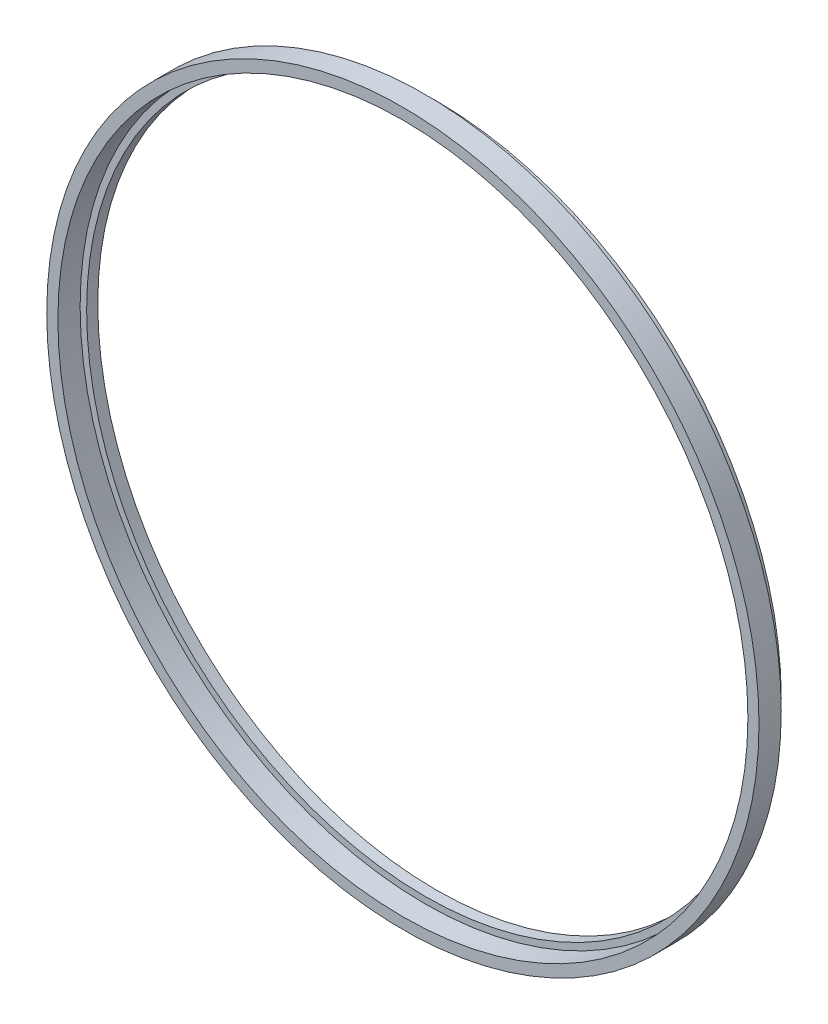
ISO-10303-21;
HEADER;
FILE_DESCRIPTION(('STEP AP214'),'2;1');
FILE_NAME('part.step','',(''),(''),'','','');
FILE_SCHEMA(('AUTOMOTIVE_DESIGN { 1 0 10303 214 1 1 1 1 }'));
ENDSEC;
DATA;
#1=APPLICATION_CONTEXT('core data for automotive mechanical design processes');
#2=APPLICATION_PROTOCOL_DEFINITION('international standard','automotive_design',2000,#1);
#3=PRODUCT_CONTEXT('',#1,'mechanical');
#4=PRODUCT('Part','Part','',(#3));
#5=PRODUCT_RELATED_PRODUCT_CATEGORY('part','',(#4));
#6=PRODUCT_DEFINITION_FORMATION('','',#4);
#7=PRODUCT_DEFINITION_CONTEXT('part definition',#1,'design');
#8=PRODUCT_DEFINITION('design','',#6,#7);
#9=PRODUCT_DEFINITION_SHAPE('','',#8);
#10=(LENGTH_UNIT() NAMED_UNIT(*) SI_UNIT(.MILLI.,.METRE.));
#11=(NAMED_UNIT(*) PLANE_ANGLE_UNIT() SI_UNIT($,.RADIAN.));
#12=(NAMED_UNIT(*) SI_UNIT($,.STERADIAN.) SOLID_ANGLE_UNIT());
#13=UNCERTAINTY_MEASURE_WITH_UNIT(LENGTH_MEASURE(1.E-05),#10,'distance_accuracy_value','');
#14=(GEOMETRIC_REPRESENTATION_CONTEXT(3) GLOBAL_UNCERTAINTY_ASSIGNED_CONTEXT((#13)) GLOBAL_UNIT_ASSIGNED_CONTEXT((#10,
#11,#12)) REPRESENTATION_CONTEXT('',''));
#15=CARTESIAN_POINT('',(0.,0.,0.));
#16=DIRECTION('',(0.,0.,1.));
#17=DIRECTION('',(1.,0.,0.));
#18=AXIS2_PLACEMENT_3D('',#15,#16,#17);
#19=CARTESIAN_POINT('',(0.,0.,-2.));
#20=DIRECTION('',(0.,0.,-1.));
#21=DIRECTION('',(-1.,0.,0.));
#22=AXIS2_PLACEMENT_3D('',#19,#20,#21);
#23=PLANE('',#22);
#24=CARTESIAN_POINT('',(0.,0.,-2.));
#25=DIRECTION('',(0.,0.,-1.));
#26=DIRECTION('',(-1.,0.,0.));
#27=AXIS2_PLACEMENT_3D('',#24,#25,#26);
#28=CIRCLE('',#27,62.);
#29=CARTESIAN_POINT('',(-62.,0.,-2.));
#30=VERTEX_POINT('',#29);
#31=EDGE_CURVE('E11',#30,#30,#28,.T.);
#32=ORIENTED_EDGE('',*,*,#31,.T.);
#33=EDGE_LOOP('',(#32));
#34=FACE_BOUND('',#33,.T.);
#35=CARTESIAN_POINT('',(0.,0.,-2.));
#36=DIRECTION('',(0.,0.,-1.));
#37=DIRECTION('',(-1.,0.,0.));
#38=AXIS2_PLACEMENT_3D('',#35,#36,#37);
#39=CIRCLE('',#38,60.83);
#40=CARTESIAN_POINT('',(-60.83,0.,-2.));
#41=VERTEX_POINT('',#40);
#42=EDGE_CURVE('E60',#41,#41,#39,.T.);
#43=ORIENTED_EDGE('',*,*,#42,.F.);
#44=EDGE_LOOP('',(#43));
#45=FACE_BOUND('',#44,.T.);
#46=ADVANCED_FACE('F49',(#34,#45),#23,.T.);
#47=CARTESIAN_POINT('',(0.,0.,0.));
#48=DIRECTION('',(0.,0.,-1.));
#49=DIRECTION('',(-1.,0.,0.));
#50=AXIS2_PLACEMENT_3D('',#47,#48,#49);
#51=PLANE('',#50);
#52=CARTESIAN_POINT('',(0.,0.,0.));
#53=DIRECTION('',(0.,0.,-1.));
#54=DIRECTION('',(-1.,0.,0.));
#55=AXIS2_PLACEMENT_3D('',#52,#53,#54);
#56=CIRCLE('',#55,62.);
#57=CARTESIAN_POINT('',(-62.,0.,0.));
#58=VERTEX_POINT('',#57);
#59=EDGE_CURVE('E53',#58,#58,#56,.T.);
#60=ORIENTED_EDGE('',*,*,#59,.F.);
#61=EDGE_LOOP('',(#60));
#62=FACE_BOUND('',#61,.T.);
#63=CARTESIAN_POINT('',(0.,0.,0.));
#64=DIRECTION('',(0.,0.,-1.));
#65=DIRECTION('',(-1.,0.,0.));
#66=AXIS2_PLACEMENT_3D('',#63,#64,#65);
#67=CIRCLE('',#66,60.83);
#68=CARTESIAN_POINT('',(-60.83,0.,0.));
#69=VERTEX_POINT('',#68);
#70=EDGE_CURVE('E62',#69,#69,#67,.T.);
#71=ORIENTED_EDGE('',*,*,#70,.T.);
#72=EDGE_LOOP('',(#71));
#73=FACE_BOUND('',#72,.T.);
#74=ADVANCED_FACE('F72',(#62,#73),#51,.F.);
#75=CARTESIAN_POINT('',(0.,0.,-2.));
#76=DIRECTION('',(0.,0.,1.));
#77=DIRECTION('',(1.,0.,0.));
#78=AXIS2_PLACEMENT_3D('',#75,#76,#77);
#79=CYLINDRICAL_SURFACE('',#78,62.);
#80=ORIENTED_EDGE('',*,*,#31,.F.);
#81=EDGE_LOOP('',(#80));
#82=FACE_BOUND('',#81,.T.);
#83=ORIENTED_EDGE('',*,*,#59,.T.);
#84=EDGE_LOOP('',(#83));
#85=FACE_BOUND('',#84,.T.);
#86=ADVANCED_FACE('F51',(#82,#85),#79,.T.);
#87=CARTESIAN_POINT('',(0.,0.,-2.));
#88=DIRECTION('',(0.,0.,1.));
#89=DIRECTION('',(1.,0.,0.));
#90=AXIS2_PLACEMENT_3D('',#87,#88,#89);
#91=CYLINDRICAL_SURFACE('',#90,60.83);
#92=ORIENTED_EDGE('',*,*,#42,.T.);
#93=EDGE_LOOP('',(#92));
#94=FACE_BOUND('',#93,.T.);
#95=ORIENTED_EDGE('',*,*,#70,.F.);
#96=EDGE_LOOP('',(#95));
#97=FACE_BOUND('',#96,.T.);
#98=ADVANCED_FACE('F68',(#94,#97),#91,.F.);
#99=CLOSED_SHELL('',(#46,#74,#86,#98));
#100=MANIFOLD_SOLID_BREP('B2',#99);
#101=CARTESIAN_POINT('',(0.,0.,4.));
#102=DIRECTION('',(0.,0.,1.));
#103=DIRECTION('',(1.,0.,0.));
#104=AXIS2_PLACEMENT_3D('',#101,#102,#103);
#105=PLANE('',#104);
#106=CARTESIAN_POINT('',(0.,0.,4.));
#107=DIRECTION('',(0.,0.,1.));
#108=DIRECTION('',(1.,0.,0.));
#109=AXIS2_PLACEMENT_3D('',#106,#107,#108);
#110=CIRCLE('',#109,64.);
#111=CARTESIAN_POINT('',(64.,0.,4.));
#112=VERTEX_POINT('',#111);
#113=EDGE_CURVE('E48',#112,#112,#110,.T.);
#114=ORIENTED_EDGE('',*,*,#113,.T.);
#115=EDGE_LOOP('',(#114));
#116=FACE_BOUND('',#115,.T.);
#117=CARTESIAN_POINT('',(0.,0.,4.));
#118=DIRECTION('',(0.,0.,1.));
#119=DIRECTION('',(1.,0.,0.));
#120=AXIS2_PLACEMENT_3D('',#117,#118,#119);
#121=CIRCLE('',#120,62.);
#122=CARTESIAN_POINT('',(62.,0.,4.));
#123=VERTEX_POINT('',#122);
#124=EDGE_CURVE('E132',#123,#123,#121,.T.);
#125=ORIENTED_EDGE('',*,*,#124,.F.);
#126=EDGE_LOOP('',(#125));
#127=FACE_BOUND('',#126,.T.);
#128=ADVANCED_FACE('F119',(#116,#127),#105,.T.);
#129=CARTESIAN_POINT('',(0.,0.,0.));
#130=DIRECTION('',(0.,0.,1.));
#131=DIRECTION('',(1.,0.,0.));
#132=AXIS2_PLACEMENT_3D('',#129,#130,#131);
#133=PLANE('',#132);
#134=CARTESIAN_POINT('',(0.,0.,0.));
#135=DIRECTION('',(0.,0.,1.));
#136=DIRECTION('',(1.,0.,0.));
#137=AXIS2_PLACEMENT_3D('',#134,#135,#136);
#138=CIRCLE('',#137,64.);
#139=CARTESIAN_POINT('',(64.,0.,0.));
#140=VERTEX_POINT('',#139);
#141=EDGE_CURVE('E123',#140,#140,#138,.T.);
#142=ORIENTED_EDGE('',*,*,#141,.F.);
#143=EDGE_LOOP('',(#142));
#144=FACE_BOUND('',#143,.T.);
#145=CARTESIAN_POINT('',(0.,0.,0.));
#146=DIRECTION('',(0.,0.,1.));
#147=DIRECTION('',(1.,0.,0.));
#148=AXIS2_PLACEMENT_3D('',#145,#146,#147);
#149=CIRCLE('',#148,62.);
#150=CARTESIAN_POINT('',(62.,0.,0.));
#151=VERTEX_POINT('',#150);
#152=EDGE_CURVE('E134',#151,#151,#149,.T.);
#153=ORIENTED_EDGE('',*,*,#152,.T.);
#154=EDGE_LOOP('',(#153));
#155=FACE_BOUND('',#154,.T.);
#156=ADVANCED_FACE('F146',(#144,#155),#133,.F.);
#157=CARTESIAN_POINT('',(0.,0.,4.));
#158=DIRECTION('',(0.,0.,-1.));
#159=DIRECTION('',(-1.,0.,0.));
#160=AXIS2_PLACEMENT_3D('',#157,#158,#159);
#161=CYLINDRICAL_SURFACE('',#160,64.);
#162=ORIENTED_EDGE('',*,*,#113,.F.);
#163=EDGE_LOOP('',(#162));
#164=FACE_BOUND('',#163,.T.);
#165=ORIENTED_EDGE('',*,*,#141,.T.);
#166=EDGE_LOOP('',(#165));
#167=FACE_BOUND('',#166,.T.);
#168=ADVANCED_FACE('F121',(#164,#167),#161,.T.);
#169=CARTESIAN_POINT('',(0.,0.,4.));
#170=DIRECTION('',(0.,0.,-1.));
#171=DIRECTION('',(-1.,0.,0.));
#172=AXIS2_PLACEMENT_3D('',#169,#170,#171);
#173=CYLINDRICAL_SURFACE('',#172,62.);
#174=ORIENTED_EDGE('',*,*,#124,.T.);
#175=EDGE_LOOP('',(#174));
#176=FACE_BOUND('',#175,.T.);
#177=ORIENTED_EDGE('',*,*,#152,.F.);
#178=EDGE_LOOP('',(#177));
#179=FACE_BOUND('',#178,.T.);
#180=ADVANCED_FACE('F142',(#176,#179),#173,.F.);
#181=CLOSED_SHELL('',(#128,#156,#168,#180));
#182=MANIFOLD_SOLID_BREP('B6',#181);
#183=ADVANCED_BREP_SHAPE_REPRESENTATION('',(#18,#100,#182),#14);
#184=SHAPE_DEFINITION_REPRESENTATION(#9,#183);
ENDSEC;
END-ISO-10303-21;
